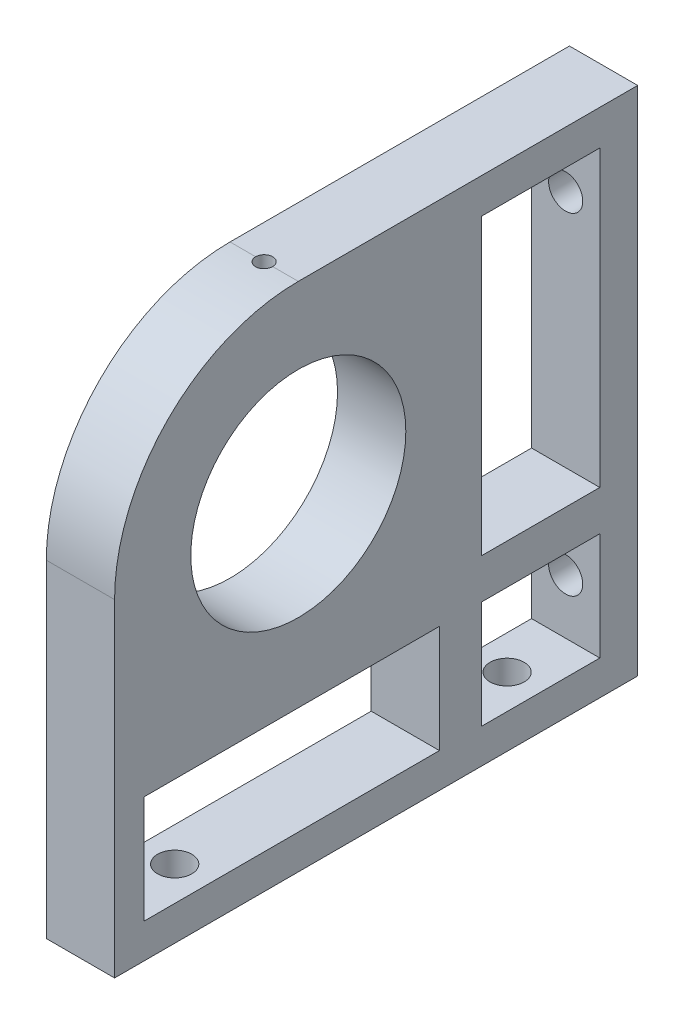
ISO-10303-21;
HEADER;
FILE_DESCRIPTION(('STEP AP214'),'2;1');
FILE_NAME('part.step','',(''),(''),'','','');
FILE_SCHEMA(('AUTOMOTIVE_DESIGN { 1 0 10303 214 1 1 1 1 }'));
ENDSEC;
DATA;
#1=APPLICATION_CONTEXT('core data for automotive mechanical design processes');
#2=APPLICATION_PROTOCOL_DEFINITION('international standard','automotive_design',2000,#1);
#3=PRODUCT_CONTEXT('',#1,'mechanical');
#4=PRODUCT('Part','Part','',(#3));
#5=PRODUCT_RELATED_PRODUCT_CATEGORY('part','',(#4));
#6=PRODUCT_DEFINITION_FORMATION('','',#4);
#7=PRODUCT_DEFINITION_CONTEXT('part definition',#1,'design');
#8=PRODUCT_DEFINITION('design','',#6,#7);
#9=PRODUCT_DEFINITION_SHAPE('','',#8);
#10=(LENGTH_UNIT() NAMED_UNIT(*) SI_UNIT(.MILLI.,.METRE.));
#11=(NAMED_UNIT(*) PLANE_ANGLE_UNIT() SI_UNIT($,.RADIAN.));
#12=(NAMED_UNIT(*) SI_UNIT($,.STERADIAN.) SOLID_ANGLE_UNIT());
#13=UNCERTAINTY_MEASURE_WITH_UNIT(LENGTH_MEASURE(1.E-05),#10,'distance_accuracy_value','');
#14=(GEOMETRIC_REPRESENTATION_CONTEXT(3) GLOBAL_UNCERTAINTY_ASSIGNED_CONTEXT((#13)) GLOBAL_UNIT_ASSIGNED_CONTEXT((#10,
#11,#12)) REPRESENTATION_CONTEXT('',''));
#15=CARTESIAN_POINT('',(0.,0.,0.));
#16=DIRECTION('',(0.,0.,1.));
#17=DIRECTION('',(1.,0.,0.));
#18=AXIS2_PLACEMENT_3D('',#15,#16,#17);
#19=CARTESIAN_POINT('',(12.7,0.,0.));
#20=DIRECTION('',(-1.,0.,0.));
#21=DIRECTION('',(0.,0.,1.));
#22=AXIS2_PLACEMENT_3D('',#19,#20,#21);
#23=CYLINDRICAL_SURFACE('',#22,34.1772994941378);
#24=CARTESIAN_POINT('',(4.7625,34.1772994941378,0.));
#25=CARTESIAN_POINT('',(4.76250026790949,34.1772999837067,0.0446371840205528));
#26=CARTESIAN_POINT('',(4.76438383799715,34.1772119353405,0.0892529592846582));
#27=CARTESIAN_POINT('',(4.77189797865805,34.1768639533168,0.178164796598809));
#28=CARTESIAN_POINT('',(4.77752835494299,34.176604028572,0.222460875106144));
#29=CARTESIAN_POINT('',(4.79998599737804,34.175575336981,0.354316865342633));
#30=CARTESIAN_POINT('',(4.82237992602887,34.1745576194624,0.44099277339279));
#31=CARTESIAN_POINT('',(4.8813868162808,34.1719711262742,0.609345875333975));
#32=CARTESIAN_POINT('',(4.91800610737773,34.170402105335,0.691020825323617));
#33=CARTESIAN_POINT('',(5.00441799039469,34.1668900986949,0.847061457686608));
#34=CARTESIAN_POINT('',(5.05420821012268,34.1649471803533,0.921428452977753));
#35=CARTESIAN_POINT('',(5.1655916630748,34.1609042269204,1.06080068039415));
#36=CARTESIAN_POINT('',(5.22719304599795,34.1588040839578,1.1257993938438));
#37=CARTESIAN_POINT('',(5.36044281418988,34.1546840432824,1.24454715061957));
#38=CARTESIAN_POINT('',(5.43209272765646,34.1526641578355,1.29829447971089));
#39=CARTESIAN_POINT('',(5.58343540406239,34.1489318947406,1.39302109568929));
#40=CARTESIAN_POINT('',(5.66313145383234,34.1472196435611,1.43399513654733));
#41=CARTESIAN_POINT('',(5.82827581515717,34.1442972106569,1.50197635694569));
#42=CARTESIAN_POINT('',(5.91372373276477,34.1430869945881,1.52898449191761));
#43=CARTESIAN_POINT('',(6.08788646105278,34.1413059964871,1.56825245133134));
#44=CARTESIAN_POINT('',(6.17659890877046,34.1407347609926,1.58052273517086));
#45=CARTESIAN_POINT('',(6.35482831566443,34.1402947760713,1.58999902304788));
#46=CARTESIAN_POINT('',(6.44434528902699,34.1404260390561,1.58720476092855));
#47=CARTESIAN_POINT('',(6.62156664606822,34.1413758512805,1.56663947436708));
#48=CARTESIAN_POINT('',(6.70927239592584,34.1421938615533,1.54888019459581));
#49=CARTESIAN_POINT('',(6.88045607395414,34.1444241145021,1.49890724055859));
#50=CARTESIAN_POINT('',(6.96393400467079,34.1458363568204,1.4666935749971));
#51=CARTESIAN_POINT('',(7.12433229910377,34.149096553101,1.3887121179436));
#52=CARTESIAN_POINT('',(7.20124991414982,34.1509446884866,1.34293868069922));
#53=CARTESIAN_POINT('',(7.34630996044648,34.1548680608808,1.23914332996758));
#54=CARTESIAN_POINT('',(7.41445275913883,34.1569432883734,1.18112192962732));
#55=CARTESIAN_POINT('',(7.54009228113583,34.1610891128059,1.05442088315336));
#56=CARTESIAN_POINT('',(7.5975803077027,34.1631597046122,0.985732613714073));
#57=CARTESIAN_POINT('',(7.70022859510056,34.1670619322109,0.839647868226824));
#58=CARTESIAN_POINT('',(7.74538497170205,34.1688934926185,0.762248659217927));
#59=CARTESIAN_POINT('',(7.82208513158054,34.1721114943803,0.600924190294484));
#60=CARTESIAN_POINT('',(7.85362032123405,34.1734976545902,0.516994849797121));
#61=CARTESIAN_POINT('',(7.90210134406539,34.1756648332044,0.345089928675814));
#62=CARTESIAN_POINT('',(7.91906941097798,34.1764467736437,0.257120731065333));
#63=CARTESIAN_POINT('',(7.93152557015448,34.177022470095,0.140466896267022));
#64=CARTESIAN_POINT('',(7.93376715115925,34.1771262992246,0.112395649537141));
#65=CARTESIAN_POINT('',(7.93675232450609,34.1772647199219,0.0562200814928645));
#66=CARTESIAN_POINT('',(7.93749839446322,34.1772994260052,0.028115892192447));
#67=CARTESIAN_POINT('',(7.9375,34.1772994941378,0.));
#68=B_SPLINE_CURVE_WITH_KNOTS('',3,(#24,#25,#26,#27,#28,#29,#30,#31,#32,#33,#34,#35,#36,#37,#38,
#39,#40,#41,#42,#43,#44,#45,#46,#47,#48,#49,#50,#51,#52,#53,#54,#55,#56,#57,#58,#59,#60,#61,#62,
#63,#64,#65,#66,#67),.UNSPECIFIED.,.F.,.F.,(4,2,2,2,2,2,2,2,2,2,2,2,2,2,2,2,2,2,2,2,2,4),(0.,
0.133829225553747,0.267651512017375,0.534857025249331,0.802181566516119,1.06945799318837,
1.33691950854433,1.60442174410534,1.87203369936189,2.13962734440225,2.40703096681064,
2.67443931365834,2.94163799144762,3.2088365083296,3.47614643283973,3.74344516021656,
4.01096111295119,4.27856123106487,4.54632993269445,4.81368920982746,4.89814360061095,
4.98245795967496),.UNSPECIFIED.);
#69=CARTESIAN_POINT('',(4.7625,34.1772994941378,0.));
#70=VERTEX_POINT('',#69);
#71=CARTESIAN_POINT('',(7.9375,34.1772994941378,0.));
#72=VERTEX_POINT('',#71);
#73=EDGE_CURVE('E302',#70,#72,#68,.T.);
#74=ORIENTED_EDGE('',*,*,#73,.F.);
#75=DIRECTION('',(-1.,0.,0.));
#76=VECTOR('',#75,1.);
#77=CARTESIAN_POINT('',(12.7,34.1772994941378,0.));
#78=LINE('',#77,#76);
#79=CARTESIAN_POINT('',(0.,34.1772994941378,0.));
#80=VERTEX_POINT('',#79);
#81=EDGE_CURVE('E443',#70,#80,#78,.T.);
#82=ORIENTED_EDGE('',*,*,#81,.T.);
#83=CARTESIAN_POINT('',(0.,0.,0.));
#84=DIRECTION('',(1.,0.,0.));
#85=DIRECTION('',(0.,0.,-1.));
#86=AXIS2_PLACEMENT_3D('',#83,#84,#85);
#87=CIRCLE('',#86,34.1772994941378);
#88=CARTESIAN_POINT('',(0.,0.,34.1772994941378));
#89=VERTEX_POINT('',#88);
#90=EDGE_CURVE('E431',#80,#89,#87,.T.);
#91=ORIENTED_EDGE('',*,*,#90,.T.);
#92=DIRECTION('',(-1.,0.,0.));
#93=VECTOR('',#92,1.);
#94=CARTESIAN_POINT('',(12.7,0.,34.1772994941378));
#95=LINE('',#94,#93);
#96=CARTESIAN_POINT('',(12.7,0.,34.1772994941378));
#97=VERTEX_POINT('',#96);
#98=EDGE_CURVE('E439',#97,#89,#95,.T.);
#99=ORIENTED_EDGE('',*,*,#98,.F.);
#100=CARTESIAN_POINT('',(12.7,0.,0.));
#101=DIRECTION('',(1.,0.,0.));
#102=DIRECTION('',(0.,0.,-1.));
#103=AXIS2_PLACEMENT_3D('',#100,#101,#102);
#104=CIRCLE('',#103,34.1772994941378);
#105=CARTESIAN_POINT('',(12.7,34.1772994941378,0.));
#106=VERTEX_POINT('',#105);
#107=EDGE_CURVE('E417',#106,#97,#104,.T.);
#108=ORIENTED_EDGE('',*,*,#107,.F.);
#109=EDGE_CURVE('E444',#106,#72,#78,.T.);
#110=ORIENTED_EDGE('',*,*,#109,.T.);
#111=EDGE_LOOP('',(#74,#82,#91,#99,#108,#110));
#112=FACE_BOUND('',#111,.T.);
#113=ADVANCED_FACE('F41',(#112),#23,.T.);
#114=CARTESIAN_POINT('',(12.7,0.,0.));
#115=DIRECTION('',(-1.,0.,0.));
#116=DIRECTION('',(0.,0.,1.));
#117=AXIS2_PLACEMENT_3D('',#114,#115,#116);
#118=CYLINDRICAL_SURFACE('',#117,20.);
#119=CARTESIAN_POINT('',(0.,0.,0.));
#120=DIRECTION('',(1.,0.,0.));
#121=DIRECTION('',(0.,0.,-1.));
#122=AXIS2_PLACEMENT_3D('',#119,#120,#121);
#123=CIRCLE('',#122,20.);
#124=CARTESIAN_POINT('',(0.,0.,-20.));
#125=VERTEX_POINT('',#124);
#126=EDGE_CURVE('E311',#125,#125,#123,.T.);
#127=ORIENTED_EDGE('',*,*,#126,.F.);
#128=EDGE_LOOP('',(#127));
#129=FACE_BOUND('',#128,.T.);
#130=CARTESIAN_POINT('',(12.7,0.,0.));
#131=DIRECTION('',(1.,0.,0.));
#132=DIRECTION('',(0.,0.,-1.));
#133=AXIS2_PLACEMENT_3D('',#130,#131,#132);
#134=CIRCLE('',#133,20.);
#135=CARTESIAN_POINT('',(12.7,0.,-20.));
#136=VERTEX_POINT('',#135);
#137=EDGE_CURVE('E312',#136,#136,#134,.T.);
#138=ORIENTED_EDGE('',*,*,#137,.T.);
#139=EDGE_LOOP('',(#138));
#140=FACE_BOUND('',#139,.T.);
#141=CARTESIAN_POINT('',(6.35,19.9368965425916,-1.5875));
#142=CARTESIAN_POINT('',(6.26098025448651,19.9368973804158,-1.58749610492407));
#143=CARTESIAN_POINT('',(6.17189953900119,19.9374991796175,-1.57998708468335));
#144=CARTESIAN_POINT('',(5.99620179186203,19.9398413939692,-1.55014211953796));
#145=CARTESIAN_POINT('',(5.90958768534372,19.9415831066861,-1.5277892774403));
#146=CARTESIAN_POINT('',(5.74139334542473,19.9460066399657,-1.46890627071113));
#147=CARTESIAN_POINT('',(5.65981032935035,19.9486879352646,-1.43238402611705));
#148=CARTESIAN_POINT('',(5.50395244614678,19.9546878594617,-1.34621277618848));
#149=CARTESIAN_POINT('',(5.42967599793898,19.9580063500155,-1.29656661936764));
#150=CARTESIAN_POINT('',(5.2903459394124,19.9649154878419,-1.18543094380747));
#151=CARTESIAN_POINT('',(5.22531178354641,19.9685066854772,-1.12391706719826));
#152=CARTESIAN_POINT('',(5.10647941726368,19.975551545039,-0.990843459071714));
#153=CARTESIAN_POINT('',(5.0526816929613,19.9790052010099,-0.919283293152191));
#154=CARTESIAN_POINT('',(4.9577853670123,19.9853909837123,-0.768033386500564));
#155=CARTESIAN_POINT('',(4.91670348155687,19.9883224218088,-0.688333126241126));
#156=CARTESIAN_POINT('',(4.84851193207035,19.993327563781,-0.523138884000306));
#157=CARTESIAN_POINT('',(4.8214020436579,19.9954012814311,-0.437644995085852));
#158=CARTESIAN_POINT('',(4.78197971933085,19.9984534905323,-0.263483046237535));
#159=CARTESIAN_POINT('',(4.76963596103257,19.9994342999911,-0.174822117527285));
#160=CARTESIAN_POINT('',(4.75999948303033,20.0001980285394,0.0033182328308929));
#161=CARTESIAN_POINT('',(4.7627065067629,19.9999809680485,0.0927976405006442));
#162=CARTESIAN_POINT('',(4.78306909032753,19.9983753303359,0.269822622796172));
#163=CARTESIAN_POINT('',(4.80069096616608,19.9969893929537,0.357372099249238));
#164=CARTESIAN_POINT('',(4.85033067960411,19.9932049552311,0.528266650716958));
#165=CARTESIAN_POINT('',(4.88234864335872,19.9908064460175,0.611611688880356));
#166=CARTESIAN_POINT('',(4.95990932956299,19.9852622014609,0.7718388945813));
#167=CARTESIAN_POINT('',(5.00546717561166,19.9821156313493,0.848713711230999));
#168=CARTESIAN_POINT('',(5.10880342263501,19.9754289821909,0.993738041439852));
#169=CARTESIAN_POINT('',(5.1665820481331,19.9718888959149,1.06188739465554));
#170=CARTESIAN_POINT('',(5.29290966016932,19.964801658358,1.18772316143928));
#171=CARTESIAN_POINT('',(5.36148790895423,19.9612545145163,1.2453802028574));
#172=CARTESIAN_POINT('',(5.5073659911768,19.9545627894882,1.3483678498522));
#173=CARTESIAN_POINT('',(5.58466583087423,19.9514182085908,1.3936984465817));
#174=CARTESIAN_POINT('',(5.7458130469786,19.9458870024835,1.47074511125654));
#175=CARTESIAN_POINT('',(5.82966112602668,19.9435004587525,1.50245971579576));
#176=CARTESIAN_POINT('',(6.00151511548273,19.9397570528339,1.5513527009541));
#177=CARTESIAN_POINT('',(6.08952094665088,19.9384001710311,1.56853135848624));
#178=CARTESIAN_POINT('',(6.26693543122619,19.9368728330717,1.58782775265304));
#179=CARTESIAN_POINT('',(6.35633960609942,19.9366991525122,1.58998642137891));
#180=CARTESIAN_POINT('',(6.53423859776487,19.9375493678744,1.57928872417309));
#181=CARTESIAN_POINT('',(6.6227334222348,19.9385732536766,1.56643248511868));
#182=CARTESIAN_POINT('',(6.79618453524318,19.9417002913897,1.52610401154869));
#183=CARTESIAN_POINT('',(6.88114528027742,19.9438020365767,1.49865082592506));
#184=CARTESIAN_POINT('',(7.04525445478538,19.9488468015253,1.42992710369309));
#185=CARTESIAN_POINT('',(7.12440279949729,19.9517898335523,1.38865636563314));
#186=CARTESIAN_POINT('',(7.2748279028142,19.9581933776221,1.29336527058765));
#187=CARTESIAN_POINT('',(7.34608731461388,19.9616549921484,1.23931760538937));
#188=CARTESIAN_POINT('',(7.47853656018158,19.9687019010101,1.12004637472398));
#189=CARTESIAN_POINT('',(7.53972623655798,19.9722871972776,1.0548226346055));
#190=CARTESIAN_POINT('',(7.65043846935507,19.979187058448,0.914873985836704));
#191=CARTESIAN_POINT('',(7.69993445377297,19.9825009957854,0.840128021109424));
#192=CARTESIAN_POINT('',(7.78567207978144,19.9884757093517,0.683361801706246));
#193=CARTESIAN_POINT('',(7.82191384322322,19.9911364915851,0.601341613913729));
#194=CARTESIAN_POINT('',(7.88006849701691,19.9955021891471,0.432450937723487));
#195=CARTESIAN_POINT('',(7.901997900413,19.997208205722,0.345586164923843));
#196=CARTESIAN_POINT('',(7.93095932407855,19.9994766065342,0.169393474981317));
#197=CARTESIAN_POINT('',(7.93799159758421,20.0000390102118,0.0800655997348437));
#198=CARTESIAN_POINT('',(7.93695630559812,19.9999568546104,-0.0982554650958209));
#199=CARTESIAN_POINT('',(7.92893018688334,19.9993156082601,-0.187248899779085));
#200=CARTESIAN_POINT('',(7.89809226966775,19.9969047687221,-0.362619772019496));
#201=CARTESIAN_POINT('',(7.87528044961817,19.9951351738899,-0.448997205763875));
#202=CARTESIAN_POINT('',(7.81552898545676,19.9906662570729,-0.61668751452709));
#203=CARTESIAN_POINT('',(7.77858997780202,19.9879669769727,-0.698000617511928));
#204=CARTESIAN_POINT('',(7.6916375855302,19.981940900783,-0.853277644874581));
#205=CARTESIAN_POINT('',(7.64162443549704,19.9786141159529,-0.927241701080443));
#206=CARTESIAN_POINT('',(7.52978807224182,19.9716957052197,-1.06593297077343));
#207=CARTESIAN_POINT('',(7.46793427435461,19.9681034085776,-1.1306354880067));
#208=CARTESIAN_POINT('',(7.33422582969639,19.9610645280181,-1.24876525521232));
#209=CARTESIAN_POINT('',(7.26236875941926,19.9576179796759,-1.30218976493019));
#210=CARTESIAN_POINT('',(7.11056641642248,19.9512543058174,-1.39631221443773));
#211=CARTESIAN_POINT('',(7.03060731219558,19.9483381102454,-1.43698788845972));
#212=CARTESIAN_POINT('',(6.86502655619547,19.9433767608586,-1.50428474141509));
#213=CARTESIAN_POINT('',(6.77941156975885,19.9413306021573,-1.53092214302011));
#214=CARTESIAN_POINT('',(6.6360728407171,19.9388693672406,-1.5625724809211));
#215=CARTESIAN_POINT('',(6.57927202885497,19.9381329386128,-1.57190794674658));
#216=CARTESIAN_POINT('',(6.46498929166921,19.9371462562507,-1.58437295697398));
#217=CARTESIAN_POINT('',(6.40750736797793,19.9368960013514,-1.58750251624584));
#218=CARTESIAN_POINT('',(6.35,19.9368965425916,-1.5875));
#219=B_SPLINE_CURVE_WITH_KNOTS('',3,(#141,#142,#143,#144,#145,#146,#147,#148,#149,#150,#151,
#152,#153,#154,#155,#156,#157,#158,#159,#160,#161,#162,#163,#164,#165,#166,#167,#168,#169,#170,
#171,#172,#173,#174,#175,#176,#177,#178,#179,#180,#181,#182,#183,#184,#185,#186,#187,#188,#189,
#190,#191,#192,#193,#194,#195,#196,#197,#198,#199,#200,#201,#202,#203,#204,#205,#206,#207,#208,
#209,#210,#211,#212,#213,#214,#215,#216,#217,#218),.UNSPECIFIED.,.T.,.F.,(4,2,2,2,2,2,2,2,2,2,2,
2,2,2,2,2,2,2,2,2,2,2,2,2,2,2,2,2,2,2,2,2,2,2,2,2,2,2,4),(0.,0.266849273410423,
0.534002831707493,0.80100727822248,1.06795381957831,1.33545419819953,1.6029661471184,
1.87082828705991,2.13868612517237,2.40597476145241,2.67325884140507,2.93994088752957,
3.20662527067537,3.47360865815122,3.74059695114299,4.00832152345589,4.27604628792475,
4.54379981945159,4.8115482500994,5.07856673275212,5.3455829590919,5.61225158367545,
5.87892409629629,6.14617180674109,6.41342369391476,6.68127714869726,6.94912814093671,
7.21666954823388,7.48420640756028,7.75100797747894,8.01780993623683,8.2845998764668,
8.55138503012376,8.81886882844023,9.08641754355868,9.35443096023133,9.6221339768414,
9.79452085620478,9.9669073225122),.UNSPECIFIED.);
#220=CARTESIAN_POINT('',(6.35,19.9368965425916,-1.5875));
#221=VERTEX_POINT('',#220);
#222=EDGE_CURVE('E301',#221,#221,#219,.T.);
#223=ORIENTED_EDGE('',*,*,#222,.T.);
#224=EDGE_LOOP('',(#223));
#225=FACE_BOUND('',#224,.T.);
#226=ADVANCED_FACE('F326',(#129,#140,#225),#118,.F.);
#227=CARTESIAN_POINT('',(12.7,0.,0.));
#228=DIRECTION('',(1.,0.,0.));
#229=DIRECTION('',(0.,0.,-1.));
#230=AXIS2_PLACEMENT_3D('',#227,#228,#229);
#231=PLANE('',#230);
#232=DIRECTION('',(0.,1.,0.));
#233=VECTOR('',#232,1.);
#234=CARTESIAN_POINT('',(12.7,0.,-56.0861744861592));
#235=LINE('',#234,#233);
#236=CARTESIAN_POINT('',(12.7,-27.0644767743261,-56.0861744861592));
#237=VERTEX_POINT('',#236);
#238=CARTESIAN_POINT('',(12.7,27.6280293112542,-56.0861744861592));
#239=VERTEX_POINT('',#238);
#240=EDGE_CURVE('E295',#237,#239,#235,.T.);
#241=ORIENTED_EDGE('',*,*,#240,.F.);
#242=DIRECTION('',(0.,0.,-1.));
#243=VECTOR('',#242,1.);
#244=CARTESIAN_POINT('',(12.7,-27.0644767743261,0.));
#245=LINE('',#244,#243);
#246=CARTESIAN_POINT('',(12.7,-27.0644767743261,-34.1044973991317));
#247=VERTEX_POINT('',#246);
#248=EDGE_CURVE('E287',#247,#237,#245,.T.);
#249=ORIENTED_EDGE('',*,*,#248,.F.);
#250=DIRECTION('',(0.,-1.,0.));
#251=VECTOR('',#250,1.);
#252=CARTESIAN_POINT('',(12.7,0.,-34.1044973991317));
#253=LINE('',#252,#251);
#254=CARTESIAN_POINT('',(12.7,27.6280293112542,-34.1044973991317));
#255=VERTEX_POINT('',#254);
#256=EDGE_CURVE('E174',#255,#247,#253,.T.);
#257=ORIENTED_EDGE('',*,*,#256,.F.);
#258=DIRECTION('',(0.,0.,1.));
#259=VECTOR('',#258,1.);
#260=CARTESIAN_POINT('',(12.7,27.6280293112542,0.));
#261=LINE('',#260,#259);
#262=EDGE_CURVE('E292',#239,#255,#261,.T.);
#263=ORIENTED_EDGE('',*,*,#262,.F.);
#264=EDGE_LOOP('',(#241,#249,#257,#263));
#265=FACE_BOUND('',#264,.T.);
#266=DIRECTION('',(0.,0.,1.));
#267=VECTOR('',#266,1.);
#268=CARTESIAN_POINT('',(12.7,-34.5225457859962,0.));
#269=LINE('',#268,#267);
#270=CARTESIAN_POINT('',(12.7,-34.5225457859962,-56.0861744861592));
#271=VERTEX_POINT('',#270);
#272=CARTESIAN_POINT('',(12.7,-34.5225457859962,-34.1044973991317));
#273=VERTEX_POINT('',#272);
#274=EDGE_CURVE('E284',#271,#273,#269,.T.);
#275=ORIENTED_EDGE('',*,*,#274,.F.);
#276=DIRECTION('',(0.,1.,0.));
#277=VECTOR('',#276,1.);
#278=CARTESIAN_POINT('',(12.7,0.,-56.0861744861592));
#279=LINE('',#278,#277);
#280=CARTESIAN_POINT('',(12.7,-54.5415731331105,-56.0861744861592));
#281=VERTEX_POINT('',#280);
#282=EDGE_CURVE('E275',#281,#271,#279,.T.);
#283=ORIENTED_EDGE('',*,*,#282,.F.);
#284=DIRECTION('',(0.,0.,-1.));
#285=VECTOR('',#284,1.);
#286=CARTESIAN_POINT('',(12.7,-54.5415731331105,0.));
#287=LINE('',#286,#285);
#288=CARTESIAN_POINT('',(12.7,-54.5415731331105,-34.1044973991317));
#289=VERTEX_POINT('',#288);
#290=EDGE_CURVE('E278',#289,#281,#287,.T.);
#291=ORIENTED_EDGE('',*,*,#290,.F.);
#292=DIRECTION('',(0.,-1.,0.));
#293=VECTOR('',#292,1.);
#294=CARTESIAN_POINT('',(12.7,0.,-34.1044973991317));
#295=LINE('',#294,#293);
#296=EDGE_CURVE('E281',#273,#289,#295,.T.);
#297=ORIENTED_EDGE('',*,*,#296,.F.);
#298=EDGE_LOOP('',(#275,#283,#291,#297));
#299=FACE_BOUND('',#298,.T.);
#300=DIRECTION('',(0.,-1.,0.));
#301=VECTOR('',#300,1.);
#302=CARTESIAN_POINT('',(12.7,0.,28.7002942780897));
#303=LINE('',#302,#301);
#304=CARTESIAN_POINT('',(12.7,-34.5225457859962,28.7002942780897));
#305=VERTEX_POINT('',#304);
#306=CARTESIAN_POINT('',(12.7,-54.5415731331105,28.7002942780897));
#307=VERTEX_POINT('',#306);
#308=EDGE_CURVE('E272',#305,#307,#303,.T.);
#309=ORIENTED_EDGE('',*,*,#308,.F.);
#310=DIRECTION('',(0.,0.,1.));
#311=VECTOR('',#310,1.);
#312=CARTESIAN_POINT('',(12.7,-34.5225457859962,0.));
#313=LINE('',#312,#311);
#314=CARTESIAN_POINT('',(12.7,-34.5225457859962,-26.253898439479));
#315=VERTEX_POINT('',#314);
#316=EDGE_CURVE('E203',#315,#305,#313,.T.);
#317=ORIENTED_EDGE('',*,*,#316,.F.);
#318=DIRECTION('',(0.,1.,0.));
#319=VECTOR('',#318,1.);
#320=CARTESIAN_POINT('',(12.7,0.,-26.253898439479));
#321=LINE('',#320,#319);
#322=CARTESIAN_POINT('',(12.7,-54.5415731331105,-26.253898439479));
#323=VERTEX_POINT('',#322);
#324=EDGE_CURVE('E265',#323,#315,#321,.T.);
#325=ORIENTED_EDGE('',*,*,#324,.F.);
#326=DIRECTION('',(0.,0.,-1.));
#327=VECTOR('',#326,1.);
#328=CARTESIAN_POINT('',(12.7,-54.5415731331105,0.));
#329=LINE('',#328,#327);
#330=EDGE_CURVE('E269',#307,#323,#329,.T.);
#331=ORIENTED_EDGE('',*,*,#330,.F.);
#332=EDGE_LOOP('',(#309,#317,#325,#331));
#333=FACE_BOUND('',#332,.T.);
#334=DIRECTION('',(0.,0.,-1.));
#335=VECTOR('',#334,1.);
#336=CARTESIAN_POINT('',(12.7,-60.96,34.1772994941378));
#337=LINE('',#336,#335);
#338=CARTESIAN_POINT('',(12.7,-60.96,34.1772994941378));
#339=VERTEX_POINT('',#338);
#340=CARTESIAN_POINT('',(12.7,-60.96,-63.1332994941378));
#341=VERTEX_POINT('',#340);
#342=EDGE_CURVE('E392',#339,#341,#337,.T.);
#343=ORIENTED_EDGE('',*,*,#342,.T.);
#344=DIRECTION('',(0.,1.,0.));
#345=VECTOR('',#344,1.);
#346=CARTESIAN_POINT('',(12.7,34.1772994941378,-63.1332994941378));
#347=LINE('',#346,#345);
#348=CARTESIAN_POINT('',(12.7,34.1772994941378,-63.1332994941378));
#349=VERTEX_POINT('',#348);
#350=EDGE_CURVE('E410',#341,#349,#347,.T.);
#351=ORIENTED_EDGE('',*,*,#350,.T.);
#352=DIRECTION('',(0.,0.,1.));
#353=VECTOR('',#352,1.);
#354=CARTESIAN_POINT('',(12.7,34.1772994941378,-34.1772994941378));
#355=LINE('',#354,#353);
#356=EDGE_CURVE('E414',#349,#106,#355,.T.);
#357=ORIENTED_EDGE('',*,*,#356,.T.);
#358=ORIENTED_EDGE('',*,*,#107,.T.);
#359=DIRECTION('',(0.,-1.,0.));
#360=VECTOR('',#359,1.);
#361=CARTESIAN_POINT('',(12.7,0.,34.1772994941378));
#362=LINE('',#361,#360);
#363=EDGE_CURVE('E420',#97,#339,#362,.T.);
#364=ORIENTED_EDGE('',*,*,#363,.T.);
#365=EDGE_LOOP('',(#343,#351,#357,#358,#364));
#366=FACE_BOUND('',#365,.T.);
#367=ORIENTED_EDGE('',*,*,#137,.F.);
#368=EDGE_LOOP('',(#367));
#369=FACE_BOUND('',#368,.T.);
#370=ADVANCED_FACE('F378',(#265,#299,#333,#366,#369),#231,.T.);
#371=CARTESIAN_POINT('',(0.,0.,0.));
#372=DIRECTION('',(1.,0.,0.));
#373=DIRECTION('',(0.,0.,-1.));
#374=AXIS2_PLACEMENT_3D('',#371,#372,#373);
#375=PLANE('',#374);
#376=DIRECTION('',(0.,0.,1.));
#377=VECTOR('',#376,1.);
#378=CARTESIAN_POINT('',(0.,-27.0644767743261,-56.0861744861592));
#379=LINE('',#378,#377);
#380=CARTESIAN_POINT('',(0.,-27.0644767743261,-56.0861744861592));
#381=VERTEX_POINT('',#380);
#382=CARTESIAN_POINT('',(0.,-27.0644767743261,-34.1044973991317));
#383=VERTEX_POINT('',#382);
#384=EDGE_CURVE('E182',#381,#383,#379,.T.);
#385=ORIENTED_EDGE('',*,*,#384,.F.);
#386=DIRECTION('',(0.,-1.,0.));
#387=VECTOR('',#386,1.);
#388=CARTESIAN_POINT('',(0.,-27.0644767743261,-56.0861744861592));
#389=LINE('',#388,#387);
#390=CARTESIAN_POINT('',(0.,27.6280293112542,-56.0861744861592));
#391=VERTEX_POINT('',#390);
#392=EDGE_CURVE('E188',#391,#381,#389,.T.);
#393=ORIENTED_EDGE('',*,*,#392,.F.);
#394=DIRECTION('',(0.,0.,-1.));
#395=VECTOR('',#394,1.);
#396=CARTESIAN_POINT('',(0.,27.6280293112542,-56.0861744861592));
#397=LINE('',#396,#395);
#398=CARTESIAN_POINT('',(0.,27.6280293112542,-34.1044973991317));
#399=VERTEX_POINT('',#398);
#400=EDGE_CURVE('E193',#399,#391,#397,.T.);
#401=ORIENTED_EDGE('',*,*,#400,.F.);
#402=DIRECTION('',(0.,1.,0.));
#403=VECTOR('',#402,1.);
#404=CARTESIAN_POINT('',(0.,27.6280293112542,-34.1044973991317));
#405=LINE('',#404,#403);
#406=EDGE_CURVE('E171',#383,#399,#405,.T.);
#407=ORIENTED_EDGE('',*,*,#406,.F.);
#408=EDGE_LOOP('',(#385,#393,#401,#407));
#409=FACE_BOUND('',#408,.T.);
#410=DIRECTION('',(0.,-1.,0.));
#411=VECTOR('',#410,1.);
#412=CARTESIAN_POINT('',(0.,-54.5415731331105,-56.0861744861592));
#413=LINE('',#412,#411);
#414=CARTESIAN_POINT('',(0.,-34.5225457859962,-56.0861744861592));
#415=VERTEX_POINT('',#414);
#416=CARTESIAN_POINT('',(0.,-54.5415731331105,-56.0861744861592));
#417=VERTEX_POINT('',#416);
#418=EDGE_CURVE('E211',#415,#417,#413,.T.);
#419=ORIENTED_EDGE('',*,*,#418,.F.);
#420=DIRECTION('',(0.,0.,-1.));
#421=VECTOR('',#420,1.);
#422=CARTESIAN_POINT('',(0.,-34.5225457859962,-34.1044973991317));
#423=LINE('',#422,#421);
#424=CARTESIAN_POINT('',(0.,-34.5225457859962,-34.1044973991317));
#425=VERTEX_POINT('',#424);
#426=EDGE_CURVE('E208',#425,#415,#423,.T.);
#427=ORIENTED_EDGE('',*,*,#426,.F.);
#428=DIRECTION('',(0.,1.,0.));
#429=VECTOR('',#428,1.);
#430=CARTESIAN_POINT('',(0.,-34.5225457859962,-34.1044973991317));
#431=LINE('',#430,#429);
#432=CARTESIAN_POINT('',(0.,-54.5415731331105,-34.1044973991317));
#433=VERTEX_POINT('',#432);
#434=EDGE_CURVE('E219',#433,#425,#431,.T.);
#435=ORIENTED_EDGE('',*,*,#434,.F.);
#436=DIRECTION('',(0.,0.,1.));
#437=VECTOR('',#436,1.);
#438=CARTESIAN_POINT('',(0.,-54.5415731331105,-34.1044973991317));
#439=LINE('',#438,#437);
#440=EDGE_CURVE('E215',#417,#433,#439,.T.);
#441=ORIENTED_EDGE('',*,*,#440,.F.);
#442=EDGE_LOOP('',(#419,#427,#435,#441));
#443=FACE_BOUND('',#442,.T.);
#444=DIRECTION('',(0.,0.,-1.));
#445=VECTOR('',#444,1.);
#446=CARTESIAN_POINT('',(0.,-34.5225457859962,-26.253898439479));
#447=LINE('',#446,#445);
#448=CARTESIAN_POINT('',(0.,-34.5225457859962,28.7002942780897));
#449=VERTEX_POINT('',#448);
#450=CARTESIAN_POINT('',(0.,-34.5225457859962,-26.253898439479));
#451=VERTEX_POINT('',#450);
#452=EDGE_CURVE('E238',#449,#451,#447,.T.);
#453=ORIENTED_EDGE('',*,*,#452,.F.);
#454=DIRECTION('',(0.,1.,0.));
#455=VECTOR('',#454,1.);
#456=CARTESIAN_POINT('',(0.,-34.5225457859962,28.7002942780897));
#457=LINE('',#456,#455);
#458=CARTESIAN_POINT('',(0.,-54.5415731331105,28.7002942780897));
#459=VERTEX_POINT('',#458);
#460=EDGE_CURVE('E235',#459,#449,#457,.T.);
#461=ORIENTED_EDGE('',*,*,#460,.F.);
#462=DIRECTION('',(0.,0.,1.));
#463=VECTOR('',#462,1.);
#464=CARTESIAN_POINT('',(0.,-54.5415731331105,28.7002942780897));
#465=LINE('',#464,#463);
#466=CARTESIAN_POINT('',(0.,-54.5415731331105,-26.253898439479));
#467=VERTEX_POINT('',#466);
#468=EDGE_CURVE('E247',#467,#459,#465,.T.);
#469=ORIENTED_EDGE('',*,*,#468,.F.);
#470=DIRECTION('',(0.,-1.,0.));
#471=VECTOR('',#470,1.);
#472=CARTESIAN_POINT('',(0.,-54.5415731331105,-26.253898439479));
#473=LINE('',#472,#471);
#474=EDGE_CURVE('E243',#451,#467,#473,.T.);
#475=ORIENTED_EDGE('',*,*,#474,.F.);
#476=EDGE_LOOP('',(#453,#461,#469,#475));
#477=FACE_BOUND('',#476,.T.);
#478=DIRECTION('',(0.,0.,-1.));
#479=VECTOR('',#478,1.);
#480=CARTESIAN_POINT('',(0.,-60.96,34.1772994941378));
#481=LINE('',#480,#479);
#482=CARTESIAN_POINT('',(0.,-60.96,34.1772994941378));
#483=VERTEX_POINT('',#482);
#484=CARTESIAN_POINT('',(0.,-60.96,-63.1332994941378));
#485=VERTEX_POINT('',#484);
#486=EDGE_CURVE('E398',#483,#485,#481,.T.);
#487=ORIENTED_EDGE('',*,*,#486,.F.);
#488=DIRECTION('',(0.,-1.,0.));
#489=VECTOR('',#488,1.);
#490=CARTESIAN_POINT('',(0.,0.,34.1772994941378));
#491=LINE('',#490,#489);
#492=EDGE_CURVE('E411',#89,#483,#491,.T.);
#493=ORIENTED_EDGE('',*,*,#492,.F.);
#494=ORIENTED_EDGE('',*,*,#90,.F.);
#495=DIRECTION('',(0.,0.,1.));
#496=VECTOR('',#495,1.);
#497=CARTESIAN_POINT('',(0.,34.1772994941378,0.));
#498=LINE('',#497,#496);
#499=CARTESIAN_POINT('',(0.,34.1772994941378,-63.1332994941378));
#500=VERTEX_POINT('',#499);
#501=EDGE_CURVE('E427',#500,#80,#498,.T.);
#502=ORIENTED_EDGE('',*,*,#501,.F.);
#503=DIRECTION('',(0.,1.,0.));
#504=VECTOR('',#503,1.);
#505=CARTESIAN_POINT('',(0.,34.1772994941378,-63.1332994941378));
#506=LINE('',#505,#504);
#507=EDGE_CURVE('E402',#485,#500,#506,.T.);
#508=ORIENTED_EDGE('',*,*,#507,.F.);
#509=EDGE_LOOP('',(#487,#493,#494,#502,#508));
#510=FACE_BOUND('',#509,.T.);
#511=ORIENTED_EDGE('',*,*,#126,.T.);
#512=EDGE_LOOP('',(#511));
#513=FACE_BOUND('',#512,.T.);
#514=ADVANCED_FACE('F190',(#409,#443,#477,#510,#513),#375,.F.);
#515=CARTESIAN_POINT('',(12.7,-60.96,34.1772994941378));
#516=DIRECTION('',(0.,1.,0.));
#517=DIRECTION('',(0.,0.,1.));
#518=AXIS2_PLACEMENT_3D('',#515,#516,#517);
#519=PLANE('',#518);
#520=CARTESIAN_POINT('',(6.35,-60.96,16.6464442951972));
#521=DIRECTION('',(0.,-1.,0.));
#522=DIRECTION('',(0.,0.,-1.));
#523=AXIS2_PLACEMENT_3D('',#520,#521,#522);
#524=CIRCLE('',#523,3.175);
#525=CARTESIAN_POINT('',(6.35,-60.96,13.4714442951972));
#526=VERTEX_POINT('',#525);
#527=EDGE_CURVE('E342',#526,#526,#524,.T.);
#528=ORIENTED_EDGE('',*,*,#527,.F.);
#529=EDGE_LOOP('',(#528));
#530=FACE_BOUND('',#529,.T.);
#531=CARTESIAN_POINT('',(6.35,-60.96,-45.192507653705));
#532=DIRECTION('',(0.,-1.,0.));
#533=DIRECTION('',(0.,0.,-1.));
#534=AXIS2_PLACEMENT_3D('',#531,#532,#533);
#535=CIRCLE('',#534,3.175);
#536=CARTESIAN_POINT('',(6.35,-60.96,-48.3675076537049));
#537=VERTEX_POINT('',#536);
#538=EDGE_CURVE('E354',#537,#537,#535,.T.);
#539=ORIENTED_EDGE('',*,*,#538,.F.);
#540=EDGE_LOOP('',(#539));
#541=FACE_BOUND('',#540,.T.);
#542=ORIENTED_EDGE('',*,*,#486,.T.);
#543=DIRECTION('',(-1.,0.,0.));
#544=VECTOR('',#543,1.);
#545=CARTESIAN_POINT('',(12.7,-60.96,-63.1332994941378));
#546=LINE('',#545,#544);
#547=EDGE_CURVE('E11',#341,#485,#546,.T.);
#548=ORIENTED_EDGE('',*,*,#547,.F.);
#549=ORIENTED_EDGE('',*,*,#342,.F.);
#550=DIRECTION('',(-1.,0.,0.));
#551=VECTOR('',#550,1.);
#552=CARTESIAN_POINT('',(12.7,-60.96,34.1772994941378));
#553=LINE('',#552,#551);
#554=EDGE_CURVE('E422',#339,#483,#553,.T.);
#555=ORIENTED_EDGE('',*,*,#554,.T.);
#556=EDGE_LOOP('',(#542,#548,#549,#555));
#557=FACE_BOUND('',#556,.T.);
#558=ADVANCED_FACE('F43',(#530,#541,#557),#519,.F.);
#559=CARTESIAN_POINT('',(12.7,34.1772994941378,-63.1332994941378));
#560=DIRECTION('',(0.,0.,1.));
#561=DIRECTION('',(1.,0.,0.));
#562=AXIS2_PLACEMENT_3D('',#559,#560,#561);
#563=PLANE('',#562);
#564=CARTESIAN_POINT('',(6.35,17.4451399874802,-63.1332994941378));
#565=DIRECTION('',(0.,0.,-1.));
#566=DIRECTION('',(-1.,0.,0.));
#567=AXIS2_PLACEMENT_3D('',#564,#565,#566);
#568=CIRCLE('',#567,3.175);
#569=CARTESIAN_POINT('',(3.175,17.4451399874802,-63.1332994941378));
#570=VERTEX_POINT('',#569);
#571=EDGE_CURVE('E348',#570,#570,#568,.T.);
#572=ORIENTED_EDGE('',*,*,#571,.F.);
#573=EDGE_LOOP('',(#572));
#574=FACE_BOUND('',#573,.T.);
#575=CARTESIAN_POINT('',(6.35,-44.2331909415932,-63.1332994941378));
#576=DIRECTION('',(0.,0.,-1.));
#577=DIRECTION('',(-1.,0.,0.));
#578=AXIS2_PLACEMENT_3D('',#575,#576,#577);
#579=CIRCLE('',#578,3.175);
#580=CARTESIAN_POINT('',(3.175,-44.2331909415932,-63.1332994941378));
#581=VERTEX_POINT('',#580);
#582=EDGE_CURVE('E356',#581,#581,#579,.T.);
#583=ORIENTED_EDGE('',*,*,#582,.F.);
#584=EDGE_LOOP('',(#583));
#585=FACE_BOUND('',#584,.T.);
#586=ORIENTED_EDGE('',*,*,#507,.T.);
#587=DIRECTION('',(-1.,0.,0.));
#588=VECTOR('',#587,1.);
#589=CARTESIAN_POINT('',(12.7,34.1772994941378,-63.1332994941378));
#590=LINE('',#589,#588);
#591=EDGE_CURVE('E51',#349,#500,#590,.T.);
#592=ORIENTED_EDGE('',*,*,#591,.F.);
#593=ORIENTED_EDGE('',*,*,#350,.F.);
#594=ORIENTED_EDGE('',*,*,#547,.T.);
#595=EDGE_LOOP('',(#586,#592,#593,#594));
#596=FACE_BOUND('',#595,.T.);
#597=ADVANCED_FACE('F458',(#574,#585,#596),#563,.F.);
#598=CARTESIAN_POINT('',(12.7,34.1772994941378,0.));
#599=DIRECTION('',(0.,-1.,0.));
#600=DIRECTION('',(0.,0.,-1.));
#601=AXIS2_PLACEMENT_3D('',#598,#599,#600);
#602=PLANE('',#601);
#603=CARTESIAN_POINT('',(6.35,34.1772994941378,0.));
#604=DIRECTION('',(0.,1.,0.));
#605=DIRECTION('',(0.,0.,1.));
#606=AXIS2_PLACEMENT_3D('',#603,#604,#605);
#607=CIRCLE('',#606,1.5875);
#608=EDGE_CURVE('E298',#72,#70,#607,.T.);
#609=ORIENTED_EDGE('',*,*,#608,.F.);
#610=ORIENTED_EDGE('',*,*,#109,.F.);
#611=ORIENTED_EDGE('',*,*,#356,.F.);
#612=ORIENTED_EDGE('',*,*,#591,.T.);
#613=ORIENTED_EDGE('',*,*,#501,.T.);
#614=ORIENTED_EDGE('',*,*,#81,.F.);
#615=EDGE_LOOP('',(#609,#610,#611,#612,#613,#614));
#616=FACE_BOUND('',#615,.T.);
#617=ADVANCED_FACE('F453',(#616),#602,.F.);
#618=CARTESIAN_POINT('',(12.7,0.,34.1772994941378));
#619=DIRECTION('',(0.,0.,-1.));
#620=DIRECTION('',(-1.,0.,0.));
#621=AXIS2_PLACEMENT_3D('',#618,#619,#620);
#622=PLANE('',#621);
#623=ORIENTED_EDGE('',*,*,#492,.T.);
#624=ORIENTED_EDGE('',*,*,#554,.F.);
#625=ORIENTED_EDGE('',*,*,#363,.F.);
#626=ORIENTED_EDGE('',*,*,#98,.T.);
#627=EDGE_LOOP('',(#623,#624,#625,#626));
#628=FACE_BOUND('',#627,.T.);
#629=ADVANCED_FACE('F323',(#628),#622,.F.);
#630=CARTESIAN_POINT('',(6.35,34.1772994941378,0.));
#631=DIRECTION('',(0.,-1.,0.));
#632=DIRECTION('',(0.,0.,-1.));
#633=AXIS2_PLACEMENT_3D('',#630,#631,#632);
#634=CYLINDRICAL_SURFACE('',#633,1.5875);
#635=ORIENTED_EDGE('',*,*,#222,.F.);
#636=EDGE_LOOP('',(#635));
#637=FACE_BOUND('',#636,.T.);
#638=ORIENTED_EDGE('',*,*,#73,.T.);
#639=ORIENTED_EDGE('',*,*,#608,.T.);
#640=EDGE_LOOP('',(#638,#639));
#641=FACE_BOUND('',#640,.T.);
#642=ADVANCED_FACE('F317',(#637,#641),#634,.F.);
#643=CARTESIAN_POINT('',(70.866,-34.5225457859962,28.7002942780897));
#644=DIRECTION('',(0.,0.,1.));
#645=DIRECTION('',(1.,0.,0.));
#646=AXIS2_PLACEMENT_3D('',#643,#644,#645);
#647=PLANE('',#646);
#648=ORIENTED_EDGE('',*,*,#308,.T.);
#649=DIRECTION('',(-1.,0.,0.));
#650=VECTOR('',#649,1.);
#651=CARTESIAN_POINT('',(70.866,-54.5415731331105,28.7002942780897));
#652=LINE('',#651,#650);
#653=EDGE_CURVE('E212',#307,#459,#652,.T.);
#654=ORIENTED_EDGE('',*,*,#653,.T.);
#655=ORIENTED_EDGE('',*,*,#460,.T.);
#656=DIRECTION('',(-1.,0.,0.));
#657=VECTOR('',#656,1.);
#658=CARTESIAN_POINT('',(70.866,-34.5225457859962,28.7002942780897));
#659=LINE('',#658,#657);
#660=EDGE_CURVE('E251',#305,#449,#659,.T.);
#661=ORIENTED_EDGE('',*,*,#660,.F.);
#662=EDGE_LOOP('',(#648,#654,#655,#661));
#663=FACE_BOUND('',#662,.T.);
#664=ADVANCED_FACE('F322',(#663),#647,.F.);
#665=CARTESIAN_POINT('',(70.866,-54.5415731331105,28.7002942780897));
#666=DIRECTION('',(0.,-1.,0.));
#667=DIRECTION('',(0.,0.,-1.));
#668=AXIS2_PLACEMENT_3D('',#665,#666,#667);
#669=PLANE('',#668);
#670=CARTESIAN_POINT('',(6.35,-54.5415731331105,16.6464442951972));
#671=DIRECTION('',(0.,-1.,0.));
#672=DIRECTION('',(0.,0.,-1.));
#673=AXIS2_PLACEMENT_3D('',#670,#671,#672);
#674=CIRCLE('',#673,3.175);
#675=CARTESIAN_POINT('',(6.35,-54.5415731331105,13.4714442951972));
#676=VERTEX_POINT('',#675);
#677=EDGE_CURVE('E239',#676,#676,#674,.T.);
#678=ORIENTED_EDGE('',*,*,#677,.T.);
#679=EDGE_LOOP('',(#678));
#680=FACE_BOUND('',#679,.T.);
#681=ORIENTED_EDGE('',*,*,#330,.T.);
#682=DIRECTION('',(-1.,0.,0.));
#683=VECTOR('',#682,1.);
#684=CARTESIAN_POINT('',(70.866,-54.5415731331105,-26.253898439479));
#685=LINE('',#684,#683);
#686=EDGE_CURVE('E254',#323,#467,#685,.T.);
#687=ORIENTED_EDGE('',*,*,#686,.T.);
#688=ORIENTED_EDGE('',*,*,#468,.T.);
#689=ORIENTED_EDGE('',*,*,#653,.F.);
#690=EDGE_LOOP('',(#681,#687,#688,#689));
#691=FACE_BOUND('',#690,.T.);
#692=ADVANCED_FACE('F511',(#680,#691),#669,.F.);
#693=CARTESIAN_POINT('',(70.866,-54.5415731331105,-26.253898439479));
#694=DIRECTION('',(0.,0.,-1.));
#695=DIRECTION('',(-1.,0.,0.));
#696=AXIS2_PLACEMENT_3D('',#693,#694,#695);
#697=PLANE('',#696);
#698=ORIENTED_EDGE('',*,*,#324,.T.);
#699=DIRECTION('',(-1.,0.,0.));
#700=VECTOR('',#699,1.);
#701=CARTESIAN_POINT('',(70.866,-34.5225457859962,-26.253898439479));
#702=LINE('',#701,#700);
#703=EDGE_CURVE('E257',#315,#451,#702,.T.);
#704=ORIENTED_EDGE('',*,*,#703,.T.);
#705=ORIENTED_EDGE('',*,*,#474,.T.);
#706=ORIENTED_EDGE('',*,*,#686,.F.);
#707=EDGE_LOOP('',(#698,#704,#705,#706));
#708=FACE_BOUND('',#707,.T.);
#709=ADVANCED_FACE('F519',(#708),#697,.F.);
#710=CARTESIAN_POINT('',(70.866,-34.5225457859962,-26.253898439479));
#711=DIRECTION('',(0.,1.,0.));
#712=DIRECTION('',(0.,0.,1.));
#713=AXIS2_PLACEMENT_3D('',#710,#711,#712);
#714=PLANE('',#713);
#715=ORIENTED_EDGE('',*,*,#316,.T.);
#716=ORIENTED_EDGE('',*,*,#660,.T.);
#717=ORIENTED_EDGE('',*,*,#452,.T.);
#718=ORIENTED_EDGE('',*,*,#703,.F.);
#719=EDGE_LOOP('',(#715,#716,#717,#718));
#720=FACE_BOUND('',#719,.T.);
#721=ADVANCED_FACE('F524',(#720),#714,.F.);
#722=CARTESIAN_POINT('',(70.866,-34.5225457859962,-34.1044973991317));
#723=DIRECTION('',(0.,1.,0.));
#724=DIRECTION('',(0.,0.,1.));
#725=AXIS2_PLACEMENT_3D('',#722,#723,#724);
#726=PLANE('',#725);
#727=ORIENTED_EDGE('',*,*,#274,.T.);
#728=DIRECTION('',(-1.,0.,0.));
#729=VECTOR('',#728,1.);
#730=CARTESIAN_POINT('',(70.866,-34.5225457859962,-34.1044973991317));
#731=LINE('',#730,#729);
#732=EDGE_CURVE('E224',#273,#425,#731,.T.);
#733=ORIENTED_EDGE('',*,*,#732,.T.);
#734=ORIENTED_EDGE('',*,*,#426,.T.);
#735=DIRECTION('',(-1.,0.,0.));
#736=VECTOR('',#735,1.);
#737=CARTESIAN_POINT('',(70.866,-34.5225457859962,-56.0861744861592));
#738=LINE('',#737,#736);
#739=EDGE_CURVE('E223',#271,#415,#738,.T.);
#740=ORIENTED_EDGE('',*,*,#739,.F.);
#741=EDGE_LOOP('',(#727,#733,#734,#740));
#742=FACE_BOUND('',#741,.T.);
#743=ADVANCED_FACE('F534',(#742),#726,.F.);
#744=CARTESIAN_POINT('',(70.866,-34.5225457859962,-34.1044973991317));
#745=DIRECTION('',(0.,0.,1.));
#746=DIRECTION('',(1.,0.,0.));
#747=AXIS2_PLACEMENT_3D('',#744,#745,#746);
#748=PLANE('',#747);
#749=ORIENTED_EDGE('',*,*,#296,.T.);
#750=DIRECTION('',(-1.,0.,0.));
#751=VECTOR('',#750,1.);
#752=CARTESIAN_POINT('',(70.866,-54.5415731331105,-34.1044973991317));
#753=LINE('',#752,#751);
#754=EDGE_CURVE('E227',#289,#433,#753,.T.);
#755=ORIENTED_EDGE('',*,*,#754,.T.);
#756=ORIENTED_EDGE('',*,*,#434,.T.);
#757=ORIENTED_EDGE('',*,*,#732,.F.);
#758=EDGE_LOOP('',(#749,#755,#756,#757));
#759=FACE_BOUND('',#758,.T.);
#760=ADVANCED_FACE('F543',(#759),#748,.F.);
#761=CARTESIAN_POINT('',(70.866,-54.5415731331105,-34.1044973991317));
#762=DIRECTION('',(0.,-1.,0.));
#763=DIRECTION('',(0.,0.,-1.));
#764=AXIS2_PLACEMENT_3D('',#761,#762,#763);
#765=PLANE('',#764);
#766=CARTESIAN_POINT('',(6.35,-54.5415731331105,-45.192507653705));
#767=DIRECTION('',(0.,-1.,0.));
#768=DIRECTION('',(0.,0.,-1.));
#769=AXIS2_PLACEMENT_3D('',#766,#767,#768);
#770=CIRCLE('',#769,3.175);
#771=CARTESIAN_POINT('',(6.35,-54.5415731331105,-48.3675076537049));
#772=VERTEX_POINT('',#771);
#773=EDGE_CURVE('E338',#772,#772,#770,.T.);
#774=ORIENTED_EDGE('',*,*,#773,.T.);
#775=EDGE_LOOP('',(#774));
#776=FACE_BOUND('',#775,.T.);
#777=ORIENTED_EDGE('',*,*,#290,.T.);
#778=DIRECTION('',(-1.,0.,0.));
#779=VECTOR('',#778,1.);
#780=CARTESIAN_POINT('',(70.866,-54.5415731331105,-56.0861744861592));
#781=LINE('',#780,#779);
#782=EDGE_CURVE('E67',#281,#417,#781,.T.);
#783=ORIENTED_EDGE('',*,*,#782,.T.);
#784=ORIENTED_EDGE('',*,*,#440,.T.);
#785=ORIENTED_EDGE('',*,*,#754,.F.);
#786=EDGE_LOOP('',(#777,#783,#784,#785));
#787=FACE_BOUND('',#786,.T.);
#788=ADVANCED_FACE('F553',(#776,#787),#765,.F.);
#789=CARTESIAN_POINT('',(70.866,-54.5415731331105,-56.0861744861592));
#790=DIRECTION('',(0.,0.,-1.));
#791=DIRECTION('',(-1.,0.,0.));
#792=AXIS2_PLACEMENT_3D('',#789,#790,#791);
#793=PLANE('',#792);
#794=CARTESIAN_POINT('',(6.35,-44.2331909415932,-56.0861744861592));
#795=DIRECTION('',(0.,0.,-1.));
#796=DIRECTION('',(-1.,0.,0.));
#797=AXIS2_PLACEMENT_3D('',#794,#795,#796);
#798=CIRCLE('',#797,3.175);
#799=CARTESIAN_POINT('',(3.175,-44.2331909415932,-56.0861744861592));
#800=VERTEX_POINT('',#799);
#801=EDGE_CURVE('E45',#800,#800,#798,.T.);
#802=ORIENTED_EDGE('',*,*,#801,.T.);
#803=EDGE_LOOP('',(#802));
#804=FACE_BOUND('',#803,.T.);
#805=ORIENTED_EDGE('',*,*,#282,.T.);
#806=ORIENTED_EDGE('',*,*,#739,.T.);
#807=ORIENTED_EDGE('',*,*,#418,.T.);
#808=ORIENTED_EDGE('',*,*,#782,.F.);
#809=EDGE_LOOP('',(#805,#806,#807,#808));
#810=FACE_BOUND('',#809,.T.);
#811=ADVANCED_FACE('F603',(#804,#810),#793,.F.);
#812=CARTESIAN_POINT('',(70.866,-27.0644767743261,-56.0861744861592));
#813=DIRECTION('',(0.,0.,-1.));
#814=DIRECTION('',(-1.,0.,0.));
#815=AXIS2_PLACEMENT_3D('',#812,#813,#814);
#816=PLANE('',#815);
#817=CARTESIAN_POINT('',(6.35,17.4451399874802,-56.0861744861592));
#818=DIRECTION('',(0.,0.,-1.));
#819=DIRECTION('',(-1.,0.,0.));
#820=AXIS2_PLACEMENT_3D('',#817,#818,#819);
#821=CIRCLE('',#820,3.175);
#822=CARTESIAN_POINT('',(3.175,17.4451399874802,-56.0861744861592));
#823=VERTEX_POINT('',#822);
#824=EDGE_CURVE('E345',#823,#823,#821,.T.);
#825=ORIENTED_EDGE('',*,*,#824,.T.);
#826=EDGE_LOOP('',(#825));
#827=FACE_BOUND('',#826,.T.);
#828=ORIENTED_EDGE('',*,*,#240,.T.);
#829=DIRECTION('',(-1.,0.,0.));
#830=VECTOR('',#829,1.);
#831=CARTESIAN_POINT('',(70.866,27.6280293112542,-56.0861744861592));
#832=LINE('',#831,#830);
#833=EDGE_CURVE('E200',#239,#391,#832,.T.);
#834=ORIENTED_EDGE('',*,*,#833,.T.);
#835=ORIENTED_EDGE('',*,*,#392,.T.);
#836=DIRECTION('',(-1.,0.,0.));
#837=VECTOR('',#836,1.);
#838=CARTESIAN_POINT('',(70.866,-27.0644767743261,-56.0861744861592));
#839=LINE('',#838,#837);
#840=EDGE_CURVE('E178',#237,#381,#839,.T.);
#841=ORIENTED_EDGE('',*,*,#840,.F.);
#842=EDGE_LOOP('',(#828,#834,#835,#841));
#843=FACE_BOUND('',#842,.T.);
#844=ADVANCED_FACE('F371',(#827,#843),#816,.F.);
#845=CARTESIAN_POINT('',(70.866,27.6280293112542,-56.0861744861592));
#846=DIRECTION('',(0.,1.,0.));
#847=DIRECTION('',(0.,0.,1.));
#848=AXIS2_PLACEMENT_3D('',#845,#846,#847);
#849=PLANE('',#848);
#850=ORIENTED_EDGE('',*,*,#262,.T.);
#851=DIRECTION('',(-1.,0.,0.));
#852=VECTOR('',#851,1.);
#853=CARTESIAN_POINT('',(70.866,27.6280293112542,-34.1044973991317));
#854=LINE('',#853,#852);
#855=EDGE_CURVE('E177',#255,#399,#854,.T.);
#856=ORIENTED_EDGE('',*,*,#855,.T.);
#857=ORIENTED_EDGE('',*,*,#400,.T.);
#858=ORIENTED_EDGE('',*,*,#833,.F.);
#859=EDGE_LOOP('',(#850,#856,#857,#858));
#860=FACE_BOUND('',#859,.T.);
#861=ADVANCED_FACE('F376',(#860),#849,.F.);
#862=CARTESIAN_POINT('',(70.866,27.6280293112542,-34.1044973991317));
#863=DIRECTION('',(0.,0.,1.));
#864=DIRECTION('',(1.,0.,0.));
#865=AXIS2_PLACEMENT_3D('',#862,#863,#864);
#866=PLANE('',#865);
#867=ORIENTED_EDGE('',*,*,#256,.T.);
#868=DIRECTION('',(-1.,0.,0.));
#869=VECTOR('',#868,1.);
#870=CARTESIAN_POINT('',(70.866,-27.0644767743261,-34.1044973991317));
#871=LINE('',#870,#869);
#872=EDGE_CURVE('E59',#247,#383,#871,.T.);
#873=ORIENTED_EDGE('',*,*,#872,.T.);
#874=ORIENTED_EDGE('',*,*,#406,.T.);
#875=ORIENTED_EDGE('',*,*,#855,.F.);
#876=EDGE_LOOP('',(#867,#873,#874,#875));
#877=FACE_BOUND('',#876,.T.);
#878=ADVANCED_FACE('F168',(#877),#866,.F.);
#879=CARTESIAN_POINT('',(70.866,-27.0644767743261,-56.0861744861592));
#880=DIRECTION('',(0.,-1.,0.));
#881=DIRECTION('',(0.,0.,-1.));
#882=AXIS2_PLACEMENT_3D('',#879,#880,#881);
#883=PLANE('',#882);
#884=ORIENTED_EDGE('',*,*,#248,.T.);
#885=ORIENTED_EDGE('',*,*,#840,.T.);
#886=ORIENTED_EDGE('',*,*,#384,.T.);
#887=ORIENTED_EDGE('',*,*,#872,.F.);
#888=EDGE_LOOP('',(#884,#885,#886,#887));
#889=FACE_BOUND('',#888,.T.);
#890=ADVANCED_FACE('F183',(#889),#883,.F.);
#891=CARTESIAN_POINT('',(6.35,-47.498,-45.192507653705));
#892=DIRECTION('',(0.,-1.,0.));
#893=DIRECTION('',(0.,0.,-1.));
#894=AXIS2_PLACEMENT_3D('',#891,#892,#893);
#895=CYLINDRICAL_SURFACE('',#894,3.175);
#896=ORIENTED_EDGE('',*,*,#538,.T.);
#897=EDGE_LOOP('',(#896));
#898=FACE_BOUND('',#897,.T.);
#899=ORIENTED_EDGE('',*,*,#773,.F.);
#900=EDGE_LOOP('',(#899));
#901=FACE_BOUND('',#900,.T.);
#902=ADVANCED_FACE('F582',(#898,#901),#895,.F.);
#903=CARTESIAN_POINT('',(6.35,-47.498,16.6464442951972));
#904=DIRECTION('',(0.,-1.,0.));
#905=DIRECTION('',(0.,0.,-1.));
#906=AXIS2_PLACEMENT_3D('',#903,#904,#905);
#907=CYLINDRICAL_SURFACE('',#906,3.175);
#908=ORIENTED_EDGE('',*,*,#527,.T.);
#909=EDGE_LOOP('',(#908));
#910=FACE_BOUND('',#909,.T.);
#911=ORIENTED_EDGE('',*,*,#677,.F.);
#912=EDGE_LOOP('',(#911));
#913=FACE_BOUND('',#912,.T.);
#914=ADVANCED_FACE('F613',(#910,#913),#907,.F.);
#915=CARTESIAN_POINT('',(6.35,17.4451399874802,-49.6712994941378));
#916=DIRECTION('',(0.,0.,-1.));
#917=DIRECTION('',(-1.,0.,0.));
#918=AXIS2_PLACEMENT_3D('',#915,#916,#917);
#919=CYLINDRICAL_SURFACE('',#918,3.175);
#920=ORIENTED_EDGE('',*,*,#571,.T.);
#921=EDGE_LOOP('',(#920));
#922=FACE_BOUND('',#921,.T.);
#923=ORIENTED_EDGE('',*,*,#824,.F.);
#924=EDGE_LOOP('',(#923));
#925=FACE_BOUND('',#924,.T.);
#926=ADVANCED_FACE('F623',(#922,#925),#919,.F.);
#927=CARTESIAN_POINT('',(6.35,-44.2331909415932,-49.6712994941378));
#928=DIRECTION('',(0.,0.,-1.));
#929=DIRECTION('',(-1.,0.,0.));
#930=AXIS2_PLACEMENT_3D('',#927,#928,#929);
#931=CYLINDRICAL_SURFACE('',#930,3.175);
#932=ORIENTED_EDGE('',*,*,#582,.T.);
#933=EDGE_LOOP('',(#932));
#934=FACE_BOUND('',#933,.T.);
#935=ORIENTED_EDGE('',*,*,#801,.F.);
#936=EDGE_LOOP('',(#935));
#937=FACE_BOUND('',#936,.T.);
#938=ADVANCED_FACE('F653',(#934,#937),#931,.F.);
#939=CLOSED_SHELL('',(#113,#226,#370,#514,#558,#597,#617,#629,#642,#664,#692,#709,#721,#743,
#760,#788,#811,#844,#861,#878,#890,#902,#914,#926,#938));
#940=MANIFOLD_SOLID_BREP('B2',#939);
#941=ADVANCED_BREP_SHAPE_REPRESENTATION('',(#18,#940),#14);
#942=SHAPE_DEFINITION_REPRESENTATION(#9,#941);
ENDSEC;
END-ISO-10303-21;
